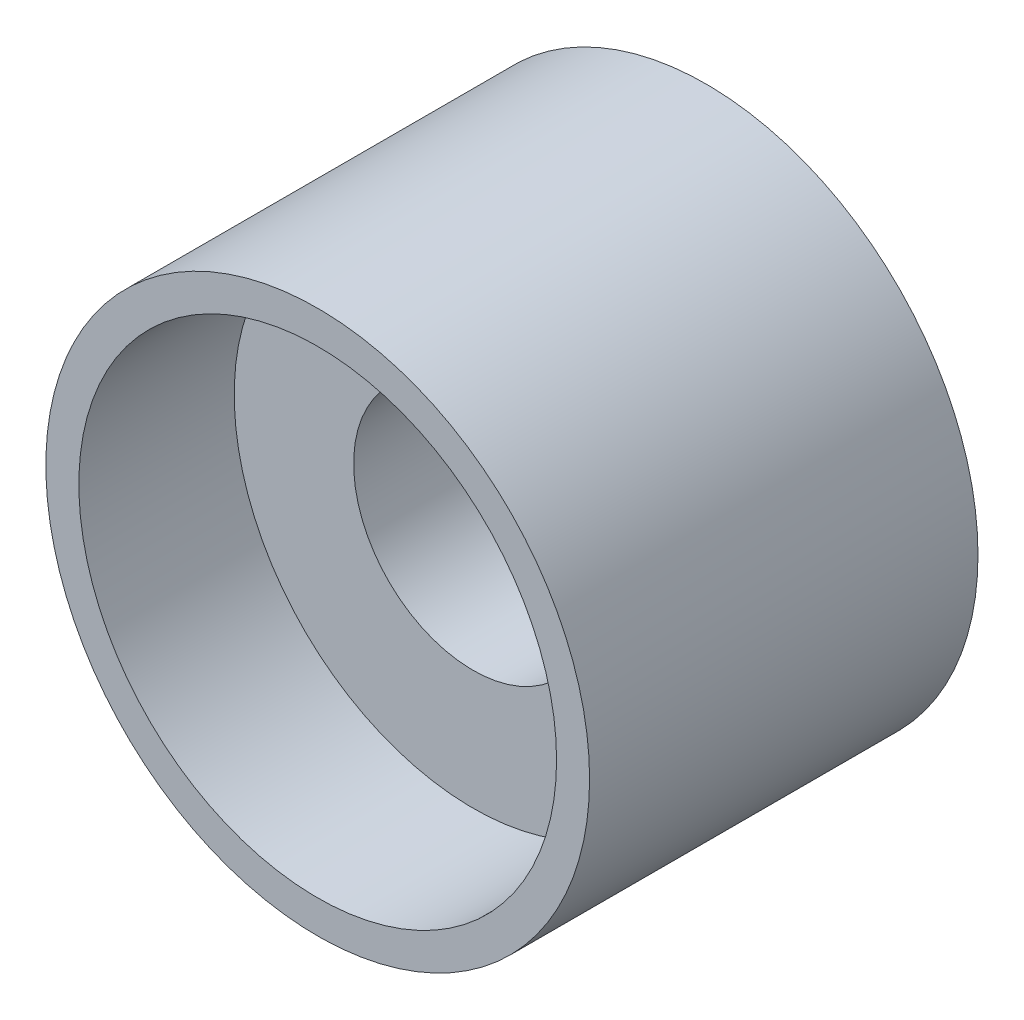
ISO-10303-21;
HEADER;
FILE_DESCRIPTION(('STEP AP214'),'2;1');
FILE_NAME('part.step','',(''),(''),'','','');
FILE_SCHEMA(('AUTOMOTIVE_DESIGN { 1 0 10303 214 1 1 1 1 }'));
ENDSEC;
DATA;
#1=APPLICATION_CONTEXT('core data for automotive mechanical design processes');
#2=APPLICATION_PROTOCOL_DEFINITION('international standard','automotive_design',2000,#1);
#3=PRODUCT_CONTEXT('',#1,'mechanical');
#4=PRODUCT('Part','Part','',(#3));
#5=PRODUCT_RELATED_PRODUCT_CATEGORY('part','',(#4));
#6=PRODUCT_DEFINITION_FORMATION('','',#4);
#7=PRODUCT_DEFINITION_CONTEXT('part definition',#1,'design');
#8=PRODUCT_DEFINITION('design','',#6,#7);
#9=PRODUCT_DEFINITION_SHAPE('','',#8);
#10=(LENGTH_UNIT() NAMED_UNIT(*) SI_UNIT(.MILLI.,.METRE.));
#11=(NAMED_UNIT(*) PLANE_ANGLE_UNIT() SI_UNIT($,.RADIAN.));
#12=(NAMED_UNIT(*) SI_UNIT($,.STERADIAN.) SOLID_ANGLE_UNIT());
#13=UNCERTAINTY_MEASURE_WITH_UNIT(LENGTH_MEASURE(1.E-05),#10,'distance_accuracy_value','');
#14=(GEOMETRIC_REPRESENTATION_CONTEXT(3) GLOBAL_UNCERTAINTY_ASSIGNED_CONTEXT((#13)) GLOBAL_UNIT_ASSIGNED_CONTEXT((#10,
#11,#12)) REPRESENTATION_CONTEXT('',''));
#15=CARTESIAN_POINT('',(0.,0.,0.));
#16=DIRECTION('',(0.,0.,1.));
#17=DIRECTION('',(1.,0.,0.));
#18=AXIS2_PLACEMENT_3D('',#15,#16,#17);
#19=CARTESIAN_POINT('',(0.,0.,20.));
#20=DIRECTION('',(0.,0.,-1.));
#21=DIRECTION('',(-1.,0.,0.));
#22=AXIS2_PLACEMENT_3D('',#19,#20,#21);
#23=CYLINDRICAL_SURFACE('',#22,6.15);
#24=CARTESIAN_POINT('',(0.,0.,0.));
#25=DIRECTION('',(0.,0.,1.));
#26=DIRECTION('',(1.,0.,0.));
#27=AXIS2_PLACEMENT_3D('',#24,#25,#26);
#28=CIRCLE('',#27,6.15);
#29=CARTESIAN_POINT('',(6.15,0.,0.));
#30=VERTEX_POINT('',#29);
#31=EDGE_CURVE('E44',#30,#30,#28,.T.);
#32=ORIENTED_EDGE('',*,*,#31,.F.);
#33=EDGE_LOOP('',(#32));
#34=FACE_BOUND('',#33,.T.);
#35=CARTESIAN_POINT('',(0.,0.,12.));
#36=DIRECTION('',(0.,0.,1.));
#37=DIRECTION('',(1.,0.,0.));
#38=AXIS2_PLACEMENT_3D('',#35,#36,#37);
#39=CIRCLE('',#38,6.15);
#40=CARTESIAN_POINT('',(6.15,0.,12.));
#41=VERTEX_POINT('',#40);
#42=EDGE_CURVE('E35',#41,#41,#39,.T.);
#43=ORIENTED_EDGE('',*,*,#42,.T.);
#44=EDGE_LOOP('',(#43));
#45=FACE_BOUND('',#44,.T.);
#46=ADVANCED_FACE('F31',(#34,#45),#23,.F.);
#47=CARTESIAN_POINT('',(0.,0.,20.));
#48=DIRECTION('',(0.,0.,1.));
#49=DIRECTION('',(1.,0.,0.));
#50=AXIS2_PLACEMENT_3D('',#47,#48,#49);
#51=PLANE('',#50);
#52=CARTESIAN_POINT('',(0.,0.,20.));
#53=DIRECTION('',(0.,0.,1.));
#54=DIRECTION('',(1.,0.,0.));
#55=AXIS2_PLACEMENT_3D('',#52,#53,#54);
#56=CIRCLE('',#55,12.3);
#57=CARTESIAN_POINT('',(12.3,0.,20.));
#58=VERTEX_POINT('',#57);
#59=EDGE_CURVE('E48',#58,#58,#56,.T.);
#60=ORIENTED_EDGE('',*,*,#59,.F.);
#61=EDGE_LOOP('',(#60));
#62=FACE_BOUND('',#61,.T.);
#63=CARTESIAN_POINT('',(0.,0.,20.));
#64=DIRECTION('',(0.,0.,1.));
#65=DIRECTION('',(1.,0.,0.));
#66=AXIS2_PLACEMENT_3D('',#63,#64,#65);
#67=CIRCLE('',#66,14.);
#68=CARTESIAN_POINT('',(14.,0.,20.));
#69=VERTEX_POINT('',#68);
#70=EDGE_CURVE('E10',#69,#69,#67,.T.);
#71=ORIENTED_EDGE('',*,*,#70,.T.);
#72=EDGE_LOOP('',(#71));
#73=FACE_BOUND('',#72,.T.);
#74=ADVANCED_FACE('F69',(#62,#73),#51,.T.);
#75=CARTESIAN_POINT('',(0.,0.,0.));
#76=DIRECTION('',(0.,0.,1.));
#77=DIRECTION('',(1.,0.,0.));
#78=AXIS2_PLACEMENT_3D('',#75,#76,#77);
#79=PLANE('',#78);
#80=CARTESIAN_POINT('',(0.,0.,0.));
#81=DIRECTION('',(0.,0.,1.));
#82=DIRECTION('',(1.,0.,0.));
#83=AXIS2_PLACEMENT_3D('',#80,#81,#82);
#84=CIRCLE('',#83,14.);
#85=CARTESIAN_POINT('',(14.,0.,0.));
#86=VERTEX_POINT('',#85);
#87=EDGE_CURVE('E39',#86,#86,#84,.T.);
#88=ORIENTED_EDGE('',*,*,#87,.F.);
#89=EDGE_LOOP('',(#88));
#90=FACE_BOUND('',#89,.T.);
#91=ORIENTED_EDGE('',*,*,#31,.T.);
#92=EDGE_LOOP('',(#91));
#93=FACE_BOUND('',#92,.T.);
#94=ADVANCED_FACE('F75',(#90,#93),#79,.F.);
#95=CARTESIAN_POINT('',(0.,0.,20.));
#96=DIRECTION('',(0.,0.,-1.));
#97=DIRECTION('',(-1.,0.,0.));
#98=AXIS2_PLACEMENT_3D('',#95,#96,#97);
#99=CYLINDRICAL_SURFACE('',#98,14.);
#100=ORIENTED_EDGE('',*,*,#70,.F.);
#101=EDGE_LOOP('',(#100));
#102=FACE_BOUND('',#101,.T.);
#103=ORIENTED_EDGE('',*,*,#87,.T.);
#104=EDGE_LOOP('',(#103));
#105=FACE_BOUND('',#104,.T.);
#106=ADVANCED_FACE('F33',(#102,#105),#99,.T.);
#107=CARTESIAN_POINT('',(0.,0.,12.));
#108=DIRECTION('',(0.,0.,1.));
#109=DIRECTION('',(1.,0.,0.));
#110=AXIS2_PLACEMENT_3D('',#107,#108,#109);
#111=CYLINDRICAL_SURFACE('',#110,12.3);
#112=CARTESIAN_POINT('',(0.,0.,12.));
#113=DIRECTION('',(0.,0.,1.));
#114=DIRECTION('',(1.,0.,0.));
#115=AXIS2_PLACEMENT_3D('',#112,#113,#114);
#116=CIRCLE('',#115,12.3);
#117=CARTESIAN_POINT('',(12.3,0.,12.));
#118=VERTEX_POINT('',#117);
#119=EDGE_CURVE('E51',#118,#118,#116,.T.);
#120=ORIENTED_EDGE('',*,*,#119,.F.);
#121=EDGE_LOOP('',(#120));
#122=FACE_BOUND('',#121,.T.);
#123=ORIENTED_EDGE('',*,*,#59,.T.);
#124=EDGE_LOOP('',(#123));
#125=FACE_BOUND('',#124,.T.);
#126=ADVANCED_FACE('F61',(#122,#125),#111,.F.);
#127=CARTESIAN_POINT('',(0.,0.,12.));
#128=DIRECTION('',(0.,0.,1.));
#129=DIRECTION('',(1.,0.,0.));
#130=AXIS2_PLACEMENT_3D('',#127,#128,#129);
#131=PLANE('',#130);
#132=ORIENTED_EDGE('',*,*,#42,.F.);
#133=EDGE_LOOP('',(#132));
#134=FACE_BOUND('',#133,.T.);
#135=ORIENTED_EDGE('',*,*,#119,.T.);
#136=EDGE_LOOP('',(#135));
#137=FACE_BOUND('',#136,.T.);
#138=ADVANCED_FACE('F59',(#134,#137),#131,.T.);
#139=CLOSED_SHELL('',(#46,#74,#94,#106,#126,#138));
#140=MANIFOLD_SOLID_BREP('B2',#139);
#141=ADVANCED_BREP_SHAPE_REPRESENTATION('',(#18,#140),#14);
#142=SHAPE_DEFINITION_REPRESENTATION(#9,#141);
ENDSEC;
END-ISO-10303-21;
